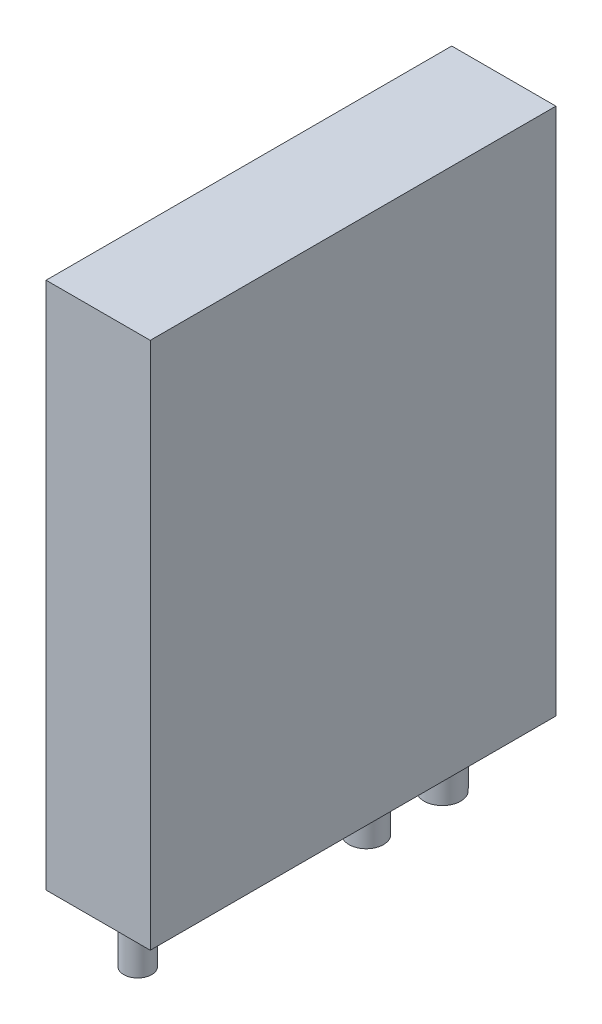
ISO-10303-21;
HEADER;
FILE_DESCRIPTION(('STEP AP214'),'2;1');
FILE_NAME('part.step','',(''),(''),'','','');
FILE_SCHEMA(('AUTOMOTIVE_DESIGN { 1 0 10303 214 1 1 1 1 }'));
ENDSEC;
DATA;
#1=APPLICATION_CONTEXT('core data for automotive mechanical design processes');
#2=APPLICATION_PROTOCOL_DEFINITION('international standard','automotive_design',2000,#1);
#3=PRODUCT_CONTEXT('',#1,'mechanical');
#4=PRODUCT('Part','Part','',(#3));
#5=PRODUCT_RELATED_PRODUCT_CATEGORY('part','',(#4));
#6=PRODUCT_DEFINITION_FORMATION('','',#4);
#7=PRODUCT_DEFINITION_CONTEXT('part definition',#1,'design');
#8=PRODUCT_DEFINITION('design','',#6,#7);
#9=PRODUCT_DEFINITION_SHAPE('','',#8);
#10=(LENGTH_UNIT() NAMED_UNIT(*) SI_UNIT(.MILLI.,.METRE.));
#11=(NAMED_UNIT(*) PLANE_ANGLE_UNIT() SI_UNIT($,.RADIAN.));
#12=(NAMED_UNIT(*) SI_UNIT($,.STERADIAN.) SOLID_ANGLE_UNIT());
#13=UNCERTAINTY_MEASURE_WITH_UNIT(LENGTH_MEASURE(1.E-05),#10,'distance_accuracy_value','');
#14=(GEOMETRIC_REPRESENTATION_CONTEXT(3) GLOBAL_UNCERTAINTY_ASSIGNED_CONTEXT((#13)) GLOBAL_UNIT_ASSIGNED_CONTEXT((#10,
#11,#12)) REPRESENTATION_CONTEXT('',''));
#15=CARTESIAN_POINT('',(0.,0.,0.));
#16=DIRECTION('',(0.,0.,1.));
#17=DIRECTION('',(1.,0.,0.));
#18=AXIS2_PLACEMENT_3D('',#15,#16,#17);
#19=CARTESIAN_POINT('',(5.21,-13.21,-10.145));
#20=DIRECTION('',(0.,0.,1.));
#21=DIRECTION('',(1.,0.,0.));
#22=AXIS2_PLACEMENT_3D('',#19,#20,#21);
#23=PLANE('',#22);
#24=DIRECTION('',(0.,1.,0.));
#25=VECTOR('',#24,1.);
#26=CARTESIAN_POINT('',(0.,-13.21,-10.145));
#27=LINE('',#26,#25);
#28=CARTESIAN_POINT('',(0.,-13.21,-10.145));
#29=VERTEX_POINT('',#28);
#30=CARTESIAN_POINT('',(0.,13.21,-10.145));
#31=VERTEX_POINT('',#30);
#32=EDGE_CURVE('E100',#29,#31,#27,.T.);
#33=ORIENTED_EDGE('',*,*,#32,.T.);
#34=DIRECTION('',(-1.,0.,0.));
#35=VECTOR('',#34,1.);
#36=CARTESIAN_POINT('',(5.21,13.21,-10.145));
#37=LINE('',#36,#35);
#38=CARTESIAN_POINT('',(5.21,13.21,-10.145));
#39=VERTEX_POINT('',#38);
#40=EDGE_CURVE('E91',#39,#31,#37,.T.);
#41=ORIENTED_EDGE('',*,*,#40,.F.);
#42=DIRECTION('',(0.,1.,0.));
#43=VECTOR('',#42,1.);
#44=CARTESIAN_POINT('',(5.21,-13.21,-10.145));
#45=LINE('',#44,#43);
#46=CARTESIAN_POINT('',(5.21,-13.21,-10.145));
#47=VERTEX_POINT('',#46);
#48=EDGE_CURVE('E85',#47,#39,#45,.T.);
#49=ORIENTED_EDGE('',*,*,#48,.F.);
#50=DIRECTION('',(-1.,0.,0.));
#51=VECTOR('',#50,1.);
#52=CARTESIAN_POINT('',(5.21,-13.21,-10.145));
#53=LINE('',#52,#51);
#54=EDGE_CURVE('E96',#47,#29,#53,.T.);
#55=ORIENTED_EDGE('',*,*,#54,.T.);
#56=EDGE_LOOP('',(#33,#41,#49,#55));
#57=FACE_BOUND('',#56,.T.);
#58=ADVANCED_FACE('F33',(#57),#23,.F.);
#59=CARTESIAN_POINT('',(5.21,13.21,10.145));
#60=DIRECTION('',(0.,-1.,0.));
#61=DIRECTION('',(0.,0.,-1.));
#62=AXIS2_PLACEMENT_3D('',#59,#60,#61);
#63=PLANE('',#62);
#64=DIRECTION('',(0.,0.,1.));
#65=VECTOR('',#64,1.);
#66=CARTESIAN_POINT('',(0.,13.21,10.145));
#67=LINE('',#66,#65);
#68=CARTESIAN_POINT('',(0.,13.21,10.145));
#69=VERTEX_POINT('',#68);
#70=EDGE_CURVE('E90',#31,#69,#67,.T.);
#71=ORIENTED_EDGE('',*,*,#70,.T.);
#72=DIRECTION('',(-1.,0.,0.));
#73=VECTOR('',#72,1.);
#74=CARTESIAN_POINT('',(5.21,13.21,10.145));
#75=LINE('',#74,#73);
#76=CARTESIAN_POINT('',(5.21,13.21,10.145));
#77=VERTEX_POINT('',#76);
#78=EDGE_CURVE('E88',#77,#69,#75,.T.);
#79=ORIENTED_EDGE('',*,*,#78,.F.);
#80=DIRECTION('',(0.,0.,1.));
#81=VECTOR('',#80,1.);
#82=CARTESIAN_POINT('',(5.21,13.21,10.145));
#83=LINE('',#82,#81);
#84=EDGE_CURVE('E80',#39,#77,#83,.T.);
#85=ORIENTED_EDGE('',*,*,#84,.F.);
#86=ORIENTED_EDGE('',*,*,#40,.T.);
#87=EDGE_LOOP('',(#71,#79,#85,#86));
#88=FACE_BOUND('',#87,.T.);
#89=ADVANCED_FACE('F89',(#88),#63,.F.);
#90=CARTESIAN_POINT('',(5.21,-13.21,10.145));
#91=DIRECTION('',(0.,0.,-1.));
#92=DIRECTION('',(-1.,0.,0.));
#93=AXIS2_PLACEMENT_3D('',#90,#91,#92);
#94=PLANE('',#93);
#95=DIRECTION('',(0.,-1.,0.));
#96=VECTOR('',#95,1.);
#97=CARTESIAN_POINT('',(0.,-13.21,10.145));
#98=LINE('',#97,#96);
#99=CARTESIAN_POINT('',(0.,-13.21,10.145));
#100=VERTEX_POINT('',#99);
#101=EDGE_CURVE('E66',#69,#100,#98,.T.);
#102=ORIENTED_EDGE('',*,*,#101,.T.);
#103=DIRECTION('',(-1.,0.,0.));
#104=VECTOR('',#103,1.);
#105=CARTESIAN_POINT('',(5.21,-13.21,10.145));
#106=LINE('',#105,#104);
#107=CARTESIAN_POINT('',(5.21,-13.21,10.145));
#108=VERTEX_POINT('',#107);
#109=EDGE_CURVE('E92',#108,#100,#106,.T.);
#110=ORIENTED_EDGE('',*,*,#109,.F.);
#111=DIRECTION('',(0.,-1.,0.));
#112=VECTOR('',#111,1.);
#113=CARTESIAN_POINT('',(5.21,-13.21,10.145));
#114=LINE('',#113,#112);
#115=EDGE_CURVE('E83',#77,#108,#114,.T.);
#116=ORIENTED_EDGE('',*,*,#115,.F.);
#117=ORIENTED_EDGE('',*,*,#78,.T.);
#118=EDGE_LOOP('',(#102,#110,#116,#117));
#119=FACE_BOUND('',#118,.T.);
#120=ADVANCED_FACE('F94',(#119),#94,.F.);
#121=CARTESIAN_POINT('',(5.21,-13.21,10.145));
#122=DIRECTION('',(0.,1.,0.));
#123=DIRECTION('',(0.,0.,1.));
#124=AXIS2_PLACEMENT_3D('',#121,#122,#123);
#125=PLANE('',#124);
#126=CARTESIAN_POINT('',(2.605,-13.21,8.16607040514719));
#127=DIRECTION('',(0.,1.,0.));
#128=DIRECTION('',(0.,0.,1.));
#129=AXIS2_PLACEMENT_3D('',#126,#127,#128);
#130=CIRCLE('',#129,0.699999999999999);
#131=CARTESIAN_POINT('',(2.605,-13.21,8.86607040514719));
#132=VERTEX_POINT('',#131);
#133=EDGE_CURVE('E11',#132,#132,#130,.F.);
#134=ORIENTED_EDGE('',*,*,#133,.F.);
#135=EDGE_LOOP('',(#134));
#136=FACE_BOUND('',#135,.T.);
#137=CARTESIAN_POINT('',(2.605,-13.21,-3.26392959485281));
#138=DIRECTION('',(0.,1.,0.));
#139=DIRECTION('',(0.,0.,1.));
#140=AXIS2_PLACEMENT_3D('',#137,#138,#139);
#141=CIRCLE('',#140,0.865);
#142=CARTESIAN_POINT('',(2.605,-13.21,-2.39892959485281));
#143=VERTEX_POINT('',#142);
#144=EDGE_CURVE('E41',#143,#143,#141,.F.);
#145=ORIENTED_EDGE('',*,*,#144,.F.);
#146=EDGE_LOOP('',(#145));
#147=FACE_BOUND('',#146,.T.);
#148=CARTESIAN_POINT('',(2.605,-13.21,-7.07392959485281));
#149=DIRECTION('',(0.,1.,0.));
#150=DIRECTION('',(0.,0.,1.));
#151=AXIS2_PLACEMENT_3D('',#148,#149,#150);
#152=CIRCLE('',#151,0.915);
#153=CARTESIAN_POINT('',(2.605,-13.21,-6.15892959485281));
#154=VERTEX_POINT('',#153);
#155=EDGE_CURVE('E110',#154,#154,#152,.F.);
#156=ORIENTED_EDGE('',*,*,#155,.F.);
#157=EDGE_LOOP('',(#156));
#158=FACE_BOUND('',#157,.T.);
#159=DIRECTION('',(0.,0.,-1.));
#160=VECTOR('',#159,1.);
#161=CARTESIAN_POINT('',(0.,-13.21,10.145));
#162=LINE('',#161,#160);
#163=EDGE_CURVE('E72',#100,#29,#162,.T.);
#164=ORIENTED_EDGE('',*,*,#163,.T.);
#165=ORIENTED_EDGE('',*,*,#54,.F.);
#166=DIRECTION('',(0.,0.,-1.));
#167=VECTOR('',#166,1.);
#168=CARTESIAN_POINT('',(5.21,-13.21,10.145));
#169=LINE('',#168,#167);
#170=EDGE_CURVE('E49',#108,#47,#169,.T.);
#171=ORIENTED_EDGE('',*,*,#170,.F.);
#172=ORIENTED_EDGE('',*,*,#109,.T.);
#173=EDGE_LOOP('',(#164,#165,#171,#172));
#174=FACE_BOUND('',#173,.T.);
#175=ADVANCED_FACE('F117',(#136,#147,#158,#174),#125,.F.);
#176=CARTESIAN_POINT('',(5.21,0.,0.));
#177=DIRECTION('',(-1.,0.,0.));
#178=DIRECTION('',(0.,0.,1.));
#179=AXIS2_PLACEMENT_3D('',#176,#177,#178);
#180=PLANE('',#179);
#181=ORIENTED_EDGE('',*,*,#48,.T.);
#182=ORIENTED_EDGE('',*,*,#84,.T.);
#183=ORIENTED_EDGE('',*,*,#115,.T.);
#184=ORIENTED_EDGE('',*,*,#170,.T.);
#185=EDGE_LOOP('',(#181,#182,#183,#184));
#186=FACE_BOUND('',#185,.T.);
#187=ADVANCED_FACE('F81',(#186),#180,.F.);
#188=CARTESIAN_POINT('',(0.,0.,0.));
#189=DIRECTION('',(-1.,0.,0.));
#190=DIRECTION('',(0.,0.,1.));
#191=AXIS2_PLACEMENT_3D('',#188,#189,#190);
#192=PLANE('',#191);
#193=ORIENTED_EDGE('',*,*,#32,.F.);
#194=ORIENTED_EDGE('',*,*,#163,.F.);
#195=ORIENTED_EDGE('',*,*,#101,.F.);
#196=ORIENTED_EDGE('',*,*,#70,.F.);
#197=EDGE_LOOP('',(#193,#194,#195,#196));
#198=FACE_BOUND('',#197,.T.);
#199=ADVANCED_FACE('F127',(#198),#192,.T.);
#200=CARTESIAN_POINT('',(2.605,-16.21,-7.07392959485281));
#201=DIRECTION('',(0.,1.,0.));
#202=DIRECTION('',(0.,0.,1.));
#203=AXIS2_PLACEMENT_3D('',#200,#201,#202);
#204=CYLINDRICAL_SURFACE('',#203,0.915);
#205=CARTESIAN_POINT('',(2.605,-16.21,-7.07392959485281));
#206=DIRECTION('',(0.,-1.,0.));
#207=DIRECTION('',(0.,0.,-1.));
#208=AXIS2_PLACEMENT_3D('',#205,#206,#207);
#209=CIRCLE('',#208,0.915);
#210=CARTESIAN_POINT('',(2.605,-16.21,-7.98892959485281));
#211=VERTEX_POINT('',#210);
#212=EDGE_CURVE('E103',#211,#211,#209,.T.);
#213=ORIENTED_EDGE('',*,*,#212,.F.);
#214=EDGE_LOOP('',(#213));
#215=FACE_BOUND('',#214,.T.);
#216=ORIENTED_EDGE('',*,*,#155,.T.);
#217=EDGE_LOOP('',(#216));
#218=FACE_BOUND('',#217,.T.);
#219=ADVANCED_FACE('F124',(#215,#218),#204,.T.);
#220=CARTESIAN_POINT('',(2.605,-16.21,-7.07392959485281));
#221=DIRECTION('',(0.,-1.,0.));
#222=DIRECTION('',(0.,0.,-1.));
#223=AXIS2_PLACEMENT_3D('',#220,#221,#222);
#224=PLANE('',#223);
#225=ORIENTED_EDGE('',*,*,#212,.T.);
#226=EDGE_LOOP('',(#225));
#227=FACE_BOUND('',#226,.T.);
#228=ADVANCED_FACE('F126',(#227),#224,.T.);
#229=CARTESIAN_POINT('',(2.605,-16.21,-3.26392959485281));
#230=DIRECTION('',(0.,1.,0.));
#231=DIRECTION('',(0.,0.,1.));
#232=AXIS2_PLACEMENT_3D('',#229,#230,#231);
#233=CYLINDRICAL_SURFACE('',#232,0.865);
#234=CARTESIAN_POINT('',(2.605,-16.21,-3.26392959485281));
#235=DIRECTION('',(0.,-1.,0.));
#236=DIRECTION('',(0.,0.,-1.));
#237=AXIS2_PLACEMENT_3D('',#234,#235,#236);
#238=CIRCLE('',#237,0.865);
#239=CARTESIAN_POINT('',(2.605,-16.21,-4.12892959485281));
#240=VERTEX_POINT('',#239);
#241=EDGE_CURVE('E149',#240,#240,#238,.T.);
#242=ORIENTED_EDGE('',*,*,#241,.F.);
#243=EDGE_LOOP('',(#242));
#244=FACE_BOUND('',#243,.T.);
#245=ORIENTED_EDGE('',*,*,#144,.T.);
#246=EDGE_LOOP('',(#245));
#247=FACE_BOUND('',#246,.T.);
#248=ADVANCED_FACE('F115',(#244,#247),#233,.T.);
#249=CARTESIAN_POINT('',(2.605,-16.21,-3.26392959485281));
#250=DIRECTION('',(0.,-1.,0.));
#251=DIRECTION('',(0.,0.,-1.));
#252=AXIS2_PLACEMENT_3D('',#249,#250,#251);
#253=PLANE('',#252);
#254=ORIENTED_EDGE('',*,*,#241,.T.);
#255=EDGE_LOOP('',(#254));
#256=FACE_BOUND('',#255,.T.);
#257=ADVANCED_FACE('F161',(#256),#253,.T.);
#258=CARTESIAN_POINT('',(2.605,-16.21,8.16607040514719));
#259=DIRECTION('',(0.,1.,0.));
#260=DIRECTION('',(0.,0.,1.));
#261=AXIS2_PLACEMENT_3D('',#258,#259,#260);
#262=CYLINDRICAL_SURFACE('',#261,0.699999999999999);
#263=CARTESIAN_POINT('',(2.605,-16.21,8.16607040514719));
#264=DIRECTION('',(0.,-1.,0.));
#265=DIRECTION('',(0.,0.,-1.));
#266=AXIS2_PLACEMENT_3D('',#263,#264,#265);
#267=CIRCLE('',#266,0.699999999999999);
#268=CARTESIAN_POINT('',(2.605,-16.21,7.46607040514719));
#269=VERTEX_POINT('',#268);
#270=EDGE_CURVE('E152',#269,#269,#267,.T.);
#271=ORIENTED_EDGE('',*,*,#270,.F.);
#272=EDGE_LOOP('',(#271));
#273=FACE_BOUND('',#272,.T.);
#274=ORIENTED_EDGE('',*,*,#133,.T.);
#275=EDGE_LOOP('',(#274));
#276=FACE_BOUND('',#275,.T.);
#277=ADVANCED_FACE('F158',(#273,#276),#262,.T.);
#278=CARTESIAN_POINT('',(2.605,-16.21,8.16607040514719));
#279=DIRECTION('',(0.,-1.,0.));
#280=DIRECTION('',(0.,0.,-1.));
#281=AXIS2_PLACEMENT_3D('',#278,#279,#280);
#282=PLANE('',#281);
#283=ORIENTED_EDGE('',*,*,#270,.T.);
#284=EDGE_LOOP('',(#283));
#285=FACE_BOUND('',#284,.T.);
#286=ADVANCED_FACE('F156',(#285),#282,.T.);
#287=CLOSED_SHELL('',(#58,#89,#120,#175,#187,#199,#219,#228,#248,#257,#277,#286));
#288=MANIFOLD_SOLID_BREP('B2',#287);
#289=ADVANCED_BREP_SHAPE_REPRESENTATION('',(#18,#288),#14);
#290=SHAPE_DEFINITION_REPRESENTATION(#9,#289);
ENDSEC;
END-ISO-10303-21;
